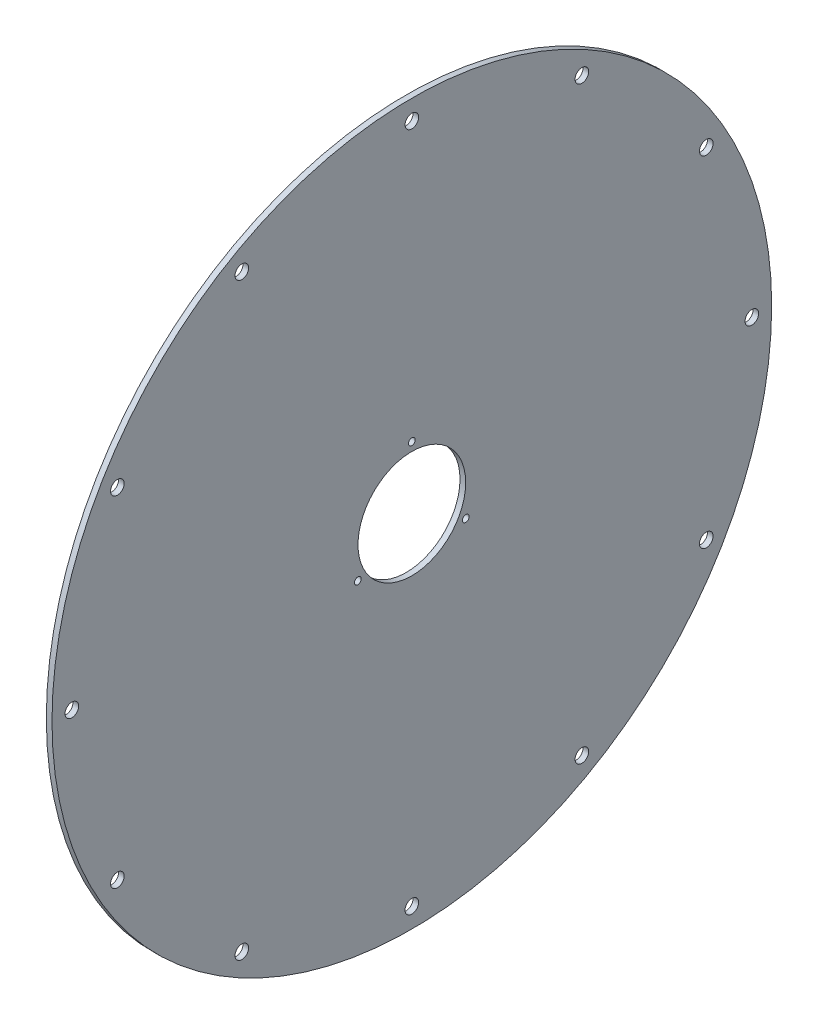
ISO-10303-21;
HEADER;
FILE_DESCRIPTION(('STEP AP214'),'2;1');
FILE_NAME('part.step','',(''),(''),'','','');
FILE_SCHEMA(('AUTOMOTIVE_DESIGN { 1 0 10303 214 1 1 1 1 }'));
ENDSEC;
DATA;
#1=APPLICATION_CONTEXT('core data for automotive mechanical design processes');
#2=APPLICATION_PROTOCOL_DEFINITION('international standard','automotive_design',2000,#1);
#3=PRODUCT_CONTEXT('',#1,'mechanical');
#4=PRODUCT('Part','Part','',(#3));
#5=PRODUCT_RELATED_PRODUCT_CATEGORY('part','',(#4));
#6=PRODUCT_DEFINITION_FORMATION('','',#4);
#7=PRODUCT_DEFINITION_CONTEXT('part definition',#1,'design');
#8=PRODUCT_DEFINITION('design','',#6,#7);
#9=PRODUCT_DEFINITION_SHAPE('','',#8);
#10=(LENGTH_UNIT() NAMED_UNIT(*) SI_UNIT(.MILLI.,.METRE.));
#11=(NAMED_UNIT(*) PLANE_ANGLE_UNIT() SI_UNIT($,.RADIAN.));
#12=(NAMED_UNIT(*) SI_UNIT($,.STERADIAN.) SOLID_ANGLE_UNIT());
#13=UNCERTAINTY_MEASURE_WITH_UNIT(LENGTH_MEASURE(1.E-05),#10,'distance_accuracy_value','');
#14=(GEOMETRIC_REPRESENTATION_CONTEXT(3) GLOBAL_UNCERTAINTY_ASSIGNED_CONTEXT((#13)) GLOBAL_UNIT_ASSIGNED_CONTEXT((#10,
#11,#12)) REPRESENTATION_CONTEXT('',''));
#15=CARTESIAN_POINT('',(0.,0.,0.));
#16=DIRECTION('',(0.,0.,1.));
#17=DIRECTION('',(1.,0.,0.));
#18=AXIS2_PLACEMENT_3D('',#15,#16,#17);
#19=CARTESIAN_POINT('',(5.,0.,0.));
#20=DIRECTION('',(1.,0.,0.));
#21=DIRECTION('',(0.,0.,-1.));
#22=AXIS2_PLACEMENT_3D('',#19,#20,#21);
#23=PLANE('',#22);
#24=CARTESIAN_POINT('',(5.,-27.5000000000002,47.631397208144));
#25=DIRECTION('',(1.,0.,0.));
#26=DIRECTION('',(0.,0.866025403784436,0.500000000000004));
#27=AXIS2_PLACEMENT_3D('',#24,#25,#26);
#28=CIRCLE('',#27,3.);
#29=CARTESIAN_POINT('',(5.,-24.9019237886469,49.131397208144));
#30=VERTEX_POINT('',#29);
#31=EDGE_CURVE('E58',#30,#30,#28,.T.);
#32=ORIENTED_EDGE('',*,*,#31,.F.);
#33=EDGE_LOOP('',(#32));
#34=FACE_BOUND('',#33,.T.);
#35=CARTESIAN_POINT('',(5.,-27.4999999999996,-47.6313972081444));
#36=DIRECTION('',(1.,0.,0.));
#37=DIRECTION('',(0.,-0.866025403784443,0.499999999999992));
#38=AXIS2_PLACEMENT_3D('',#35,#36,#37);
#39=CIRCLE('',#38,3.);
#40=CARTESIAN_POINT('',(5.,-30.0980762113529,-46.1313972081444));
#41=VERTEX_POINT('',#40);
#42=EDGE_CURVE('E63',#41,#41,#39,.T.);
#43=ORIENTED_EDGE('',*,*,#42,.F.);
#44=EDGE_LOOP('',(#43));
#45=FACE_BOUND('',#44,.T.);
#46=CARTESIAN_POINT('',(5.,55.,0.));
#47=DIRECTION('',(1.,0.,0.));
#48=DIRECTION('',(0.,0.,-1.));
#49=AXIS2_PLACEMENT_3D('',#46,#47,#48);
#50=CIRCLE('',#49,3.);
#51=CARTESIAN_POINT('',(5.,55.,-3.));
#52=VERTEX_POINT('',#51);
#53=EDGE_CURVE('E55',#52,#52,#50,.T.);
#54=ORIENTED_EDGE('',*,*,#53,.F.);
#55=EDGE_LOOP('',(#54));
#56=FACE_BOUND('',#55,.T.);
#57=CARTESIAN_POINT('',(5.,-259.807621135332,-149.999999999999));
#58=DIRECTION('',(1.,0.,0.));
#59=DIRECTION('',(0.,-0.86602540378444,-0.499999999999998));
#60=AXIS2_PLACEMENT_3D('',#57,#58,#59);
#61=CIRCLE('',#60,5.99999999999999);
#62=CARTESIAN_POINT('',(5.,-265.003773558039,-152.999999999999));
#63=VERTEX_POINT('',#62);
#64=EDGE_CURVE('E88',#63,#63,#61,.T.);
#65=ORIENTED_EDGE('',*,*,#64,.F.);
#66=EDGE_LOOP('',(#65));
#67=FACE_BOUND('',#66,.T.);
#68=CARTESIAN_POINT('',(5.,-300.,1.04744440165294E-12));
#69=DIRECTION('',(1.,0.,0.));
#70=DIRECTION('',(0.,-1.,0.));
#71=AXIS2_PLACEMENT_3D('',#68,#69,#70);
#72=CIRCLE('',#71,5.99999999999999);
#73=CARTESIAN_POINT('',(5.,-306.,1.068393289686E-12));
#74=VERTEX_POINT('',#73);
#75=EDGE_CURVE('E94',#74,#74,#72,.T.);
#76=ORIENTED_EDGE('',*,*,#75,.F.);
#77=EDGE_LOOP('',(#76));
#78=FACE_BOUND('',#77,.T.);
#79=CARTESIAN_POINT('',(5.,-259.807621135331,150.000000000001));
#80=DIRECTION('',(1.,0.,0.));
#81=DIRECTION('',(0.,-0.866025403784436,0.500000000000004));
#82=AXIS2_PLACEMENT_3D('',#79,#80,#81);
#83=CIRCLE('',#82,5.99999999999999);
#84=CARTESIAN_POINT('',(5.,-265.003773558038,153.000000000001));
#85=VERTEX_POINT('',#84);
#86=EDGE_CURVE('E100',#85,#85,#83,.T.);
#87=ORIENTED_EDGE('',*,*,#86,.F.);
#88=EDGE_LOOP('',(#87));
#89=FACE_BOUND('',#88,.T.);
#90=CARTESIAN_POINT('',(5.,-149.999999999998,259.807621135332));
#91=DIRECTION('',(1.,0.,0.));
#92=DIRECTION('',(0.,-0.499999999999995,0.866025403784442));
#93=AXIS2_PLACEMENT_3D('',#90,#91,#92);
#94=CIRCLE('',#93,5.99999999999999);
#95=CARTESIAN_POINT('',(5.,-152.999999999998,265.003773558039));
#96=VERTEX_POINT('',#95);
#97=EDGE_CURVE('E106',#96,#96,#94,.T.);
#98=ORIENTED_EDGE('',*,*,#97,.F.);
#99=EDGE_LOOP('',(#98));
#100=FACE_BOUND('',#99,.T.);
#101=CARTESIAN_POINT('',(5.,0.,300.));
#102=DIRECTION('',(1.,0.,0.));
#103=DIRECTION('',(0.,0.,1.));
#104=AXIS2_PLACEMENT_3D('',#101,#102,#103);
#105=CIRCLE('',#104,5.99999999999999);
#106=CARTESIAN_POINT('',(5.,0.,306.));
#107=VERTEX_POINT('',#106);
#108=EDGE_CURVE('E112',#107,#107,#105,.T.);
#109=ORIENTED_EDGE('',*,*,#108,.F.);
#110=EDGE_LOOP('',(#109));
#111=FACE_BOUND('',#110,.T.);
#112=CARTESIAN_POINT('',(5.,150.000000000002,259.80762113533));
#113=DIRECTION('',(1.,0.,0.));
#114=DIRECTION('',(0.,0.500000000000007,0.866025403784435));
#115=AXIS2_PLACEMENT_3D('',#112,#113,#114);
#116=CIRCLE('',#115,5.99999999999999);
#117=CARTESIAN_POINT('',(5.,153.000000000002,265.003773558037));
#118=VERTEX_POINT('',#117);
#119=EDGE_CURVE('E118',#118,#118,#116,.T.);
#120=ORIENTED_EDGE('',*,*,#119,.F.);
#121=EDGE_LOOP('',(#120));
#122=FACE_BOUND('',#121,.T.);
#123=CARTESIAN_POINT('',(5.,259.807621135333,149.999999999998));
#124=DIRECTION('',(1.,0.,0.));
#125=DIRECTION('',(0.,0.866025403784443,0.499999999999992));
#126=AXIS2_PLACEMENT_3D('',#123,#124,#125);
#127=CIRCLE('',#126,5.99999999999999);
#128=CARTESIAN_POINT('',(5.,265.00377355804,152.999999999998));
#129=VERTEX_POINT('',#128);
#130=EDGE_CURVE('E124',#129,#129,#127,.T.);
#131=ORIENTED_EDGE('',*,*,#130,.F.);
#132=EDGE_LOOP('',(#131));
#133=FACE_BOUND('',#132,.T.);
#134=CARTESIAN_POINT('',(5.,300.,-3.14233320495882E-12));
#135=DIRECTION('',(1.,0.,0.));
#136=DIRECTION('',(0.,1.,0.));
#137=AXIS2_PLACEMENT_3D('',#134,#135,#136);
#138=CIRCLE('',#137,5.99999999999999);
#139=CARTESIAN_POINT('',(5.,306.,-3.205179869058E-12));
#140=VERTEX_POINT('',#139);
#141=EDGE_CURVE('E75',#140,#140,#138,.T.);
#142=ORIENTED_EDGE('',*,*,#141,.F.);
#143=EDGE_LOOP('',(#142));
#144=FACE_BOUND('',#143,.T.);
#145=CARTESIAN_POINT('',(5.,259.80762113533,-150.000000000003));
#146=DIRECTION('',(1.,0.,0.));
#147=DIRECTION('',(0.,0.866025403784433,-0.50000000000001));
#148=AXIS2_PLACEMENT_3D('',#145,#146,#147);
#149=CIRCLE('',#148,5.99999999999999);
#150=CARTESIAN_POINT('',(5.,265.003773558036,-153.000000000003));
#151=VERTEX_POINT('',#150);
#152=EDGE_CURVE('E76',#151,#151,#149,.T.);
#153=ORIENTED_EDGE('',*,*,#152,.F.);
#154=EDGE_LOOP('',(#153));
#155=FACE_BOUND('',#154,.T.);
#156=CARTESIAN_POINT('',(5.,149.999999999997,-259.807621135334));
#157=DIRECTION('',(1.,0.,0.));
#158=DIRECTION('',(0.,0.499999999999989,-0.866025403784445));
#159=AXIS2_PLACEMENT_3D('',#156,#157,#158);
#160=CIRCLE('',#159,5.99999999999999);
#161=CARTESIAN_POINT('',(5.,152.999999999997,-265.00377355804));
#162=VERTEX_POINT('',#161);
#163=EDGE_CURVE('E54',#162,#162,#160,.T.);
#164=ORIENTED_EDGE('',*,*,#163,.F.);
#165=EDGE_LOOP('',(#164));
#166=FACE_BOUND('',#165,.T.);
#167=CARTESIAN_POINT('',(5.,-150.,-259.807621135331));
#168=DIRECTION('',(1.,0.,0.));
#169=DIRECTION('',(0.,-0.500000000000001,-0.866025403784438));
#170=AXIS2_PLACEMENT_3D('',#167,#168,#169);
#171=CIRCLE('',#170,5.99999999999999);
#172=CARTESIAN_POINT('',(5.,-153.,-265.003773558038));
#173=VERTEX_POINT('',#172);
#174=EDGE_CURVE('E87',#173,#173,#171,.T.);
#175=ORIENTED_EDGE('',*,*,#174,.F.);
#176=EDGE_LOOP('',(#175));
#177=FACE_BOUND('',#176,.T.);
#178=CARTESIAN_POINT('',(5.,0.,-300.));
#179=DIRECTION('',(1.,0.,0.));
#180=DIRECTION('',(0.,0.,-1.));
#181=AXIS2_PLACEMENT_3D('',#178,#179,#180);
#182=CIRCLE('',#181,5.99999999999999);
#183=CARTESIAN_POINT('',(5.,0.,-306.));
#184=VERTEX_POINT('',#183);
#185=EDGE_CURVE('E135',#184,#184,#182,.T.);
#186=ORIENTED_EDGE('',*,*,#185,.F.);
#187=EDGE_LOOP('',(#186));
#188=FACE_BOUND('',#187,.T.);
#189=CARTESIAN_POINT('',(5.,0.,0.));
#190=DIRECTION('',(1.,0.,0.));
#191=DIRECTION('',(0.,0.,-1.));
#192=AXIS2_PLACEMENT_3D('',#189,#190,#191);
#193=CIRCLE('',#192,317.5);
#194=CARTESIAN_POINT('',(5.,0.,-317.5));
#195=VERTEX_POINT('',#194);
#196=EDGE_CURVE('E10',#195,#195,#193,.T.);
#197=ORIENTED_EDGE('',*,*,#196,.T.);
#198=EDGE_LOOP('',(#197));
#199=FACE_BOUND('',#198,.T.);
#200=CARTESIAN_POINT('',(5.,0.,0.));
#201=DIRECTION('',(1.,0.,0.));
#202=DIRECTION('',(0.,0.,-1.));
#203=AXIS2_PLACEMENT_3D('',#200,#201,#202);
#204=CIRCLE('',#203,47.5);
#205=CARTESIAN_POINT('',(5.,0.,-47.5));
#206=VERTEX_POINT('',#205);
#207=EDGE_CURVE('E46',#206,#206,#204,.T.);
#208=ORIENTED_EDGE('',*,*,#207,.F.);
#209=EDGE_LOOP('',(#208));
#210=FACE_BOUND('',#209,.T.);
#211=ADVANCED_FACE('F33',(#34,#45,#56,#67,#78,#89,#100,#111,#122,#133,#144,#155,#166,#177,#188,
#199,#210),#23,.T.);
#212=CARTESIAN_POINT('',(0.,0.,0.));
#213=DIRECTION('',(1.,0.,0.));
#214=DIRECTION('',(0.,0.,-1.));
#215=AXIS2_PLACEMENT_3D('',#212,#213,#214);
#216=PLANE('',#215);
#217=CARTESIAN_POINT('',(0.,-27.5000000000002,47.631397208144));
#218=DIRECTION('',(1.,0.,0.));
#219=DIRECTION('',(0.,0.,-1.));
#220=AXIS2_PLACEMENT_3D('',#217,#218,#219);
#221=CIRCLE('',#220,3.);
#222=CARTESIAN_POINT('',(0.,-27.5000000000002,44.631397208144));
#223=VERTEX_POINT('',#222);
#224=EDGE_CURVE('E37',#223,#223,#221,.T.);
#225=ORIENTED_EDGE('',*,*,#224,.T.);
#226=EDGE_LOOP('',(#225));
#227=FACE_BOUND('',#226,.T.);
#228=CARTESIAN_POINT('',(0.,-27.4999999999996,-47.6313972081444));
#229=DIRECTION('',(1.,0.,0.));
#230=DIRECTION('',(0.,0.,-1.));
#231=AXIS2_PLACEMENT_3D('',#228,#229,#230);
#232=CIRCLE('',#231,3.);
#233=CARTESIAN_POINT('',(0.,-27.4999999999996,-50.6313972081444));
#234=VERTEX_POINT('',#233);
#235=EDGE_CURVE('E56',#234,#234,#232,.T.);
#236=ORIENTED_EDGE('',*,*,#235,.T.);
#237=EDGE_LOOP('',(#236));
#238=FACE_BOUND('',#237,.T.);
#239=CARTESIAN_POINT('',(0.,55.,0.));
#240=DIRECTION('',(1.,0.,0.));
#241=DIRECTION('',(0.,0.,-1.));
#242=AXIS2_PLACEMENT_3D('',#239,#240,#241);
#243=CIRCLE('',#242,3.);
#244=CARTESIAN_POINT('',(0.,55.,-3.));
#245=VERTEX_POINT('',#244);
#246=EDGE_CURVE('E52',#245,#245,#243,.T.);
#247=ORIENTED_EDGE('',*,*,#246,.T.);
#248=EDGE_LOOP('',(#247));
#249=FACE_BOUND('',#248,.T.);
#250=CARTESIAN_POINT('',(0.,-259.807621135332,-149.999999999999));
#251=DIRECTION('',(1.,0.,0.));
#252=DIRECTION('',(0.,-0.86602540378444,-0.499999999999998));
#253=AXIS2_PLACEMENT_3D('',#250,#251,#252);
#254=CIRCLE('',#253,5.99999999999999);
#255=CARTESIAN_POINT('',(0.,-265.003773558039,-152.999999999999));
#256=VERTEX_POINT('',#255);
#257=EDGE_CURVE('E84',#256,#256,#254,.T.);
#258=ORIENTED_EDGE('',*,*,#257,.T.);
#259=EDGE_LOOP('',(#258));
#260=FACE_BOUND('',#259,.T.);
#261=CARTESIAN_POINT('',(0.,-300.,1.04744440165294E-12));
#262=DIRECTION('',(1.,0.,0.));
#263=DIRECTION('',(0.,-1.,0.));
#264=AXIS2_PLACEMENT_3D('',#261,#262,#263);
#265=CIRCLE('',#264,5.99999999999999);
#266=CARTESIAN_POINT('',(0.,-306.,1.068393289686E-12));
#267=VERTEX_POINT('',#266);
#268=EDGE_CURVE('E91',#267,#267,#265,.T.);
#269=ORIENTED_EDGE('',*,*,#268,.T.);
#270=EDGE_LOOP('',(#269));
#271=FACE_BOUND('',#270,.T.);
#272=CARTESIAN_POINT('',(0.,-259.807621135331,150.000000000001));
#273=DIRECTION('',(1.,0.,0.));
#274=DIRECTION('',(0.,-0.866025403784436,0.500000000000004));
#275=AXIS2_PLACEMENT_3D('',#272,#273,#274);
#276=CIRCLE('',#275,5.99999999999999);
#277=CARTESIAN_POINT('',(0.,-265.003773558038,153.000000000001));
#278=VERTEX_POINT('',#277);
#279=EDGE_CURVE('E97',#278,#278,#276,.T.);
#280=ORIENTED_EDGE('',*,*,#279,.T.);
#281=EDGE_LOOP('',(#280));
#282=FACE_BOUND('',#281,.T.);
#283=CARTESIAN_POINT('',(0.,-149.999999999998,259.807621135332));
#284=DIRECTION('',(1.,0.,0.));
#285=DIRECTION('',(0.,-0.499999999999995,0.866025403784442));
#286=AXIS2_PLACEMENT_3D('',#283,#284,#285);
#287=CIRCLE('',#286,5.99999999999999);
#288=CARTESIAN_POINT('',(0.,-152.999999999998,265.003773558039));
#289=VERTEX_POINT('',#288);
#290=EDGE_CURVE('E103',#289,#289,#287,.T.);
#291=ORIENTED_EDGE('',*,*,#290,.T.);
#292=EDGE_LOOP('',(#291));
#293=FACE_BOUND('',#292,.T.);
#294=CARTESIAN_POINT('',(0.,0.,300.));
#295=DIRECTION('',(1.,0.,0.));
#296=DIRECTION('',(0.,0.,1.));
#297=AXIS2_PLACEMENT_3D('',#294,#295,#296);
#298=CIRCLE('',#297,5.99999999999999);
#299=CARTESIAN_POINT('',(0.,0.,306.));
#300=VERTEX_POINT('',#299);
#301=EDGE_CURVE('E109',#300,#300,#298,.T.);
#302=ORIENTED_EDGE('',*,*,#301,.T.);
#303=EDGE_LOOP('',(#302));
#304=FACE_BOUND('',#303,.T.);
#305=CARTESIAN_POINT('',(0.,150.000000000002,259.80762113533));
#306=DIRECTION('',(1.,0.,0.));
#307=DIRECTION('',(0.,0.500000000000007,0.866025403784435));
#308=AXIS2_PLACEMENT_3D('',#305,#306,#307);
#309=CIRCLE('',#308,5.99999999999999);
#310=CARTESIAN_POINT('',(0.,153.000000000002,265.003773558037));
#311=VERTEX_POINT('',#310);
#312=EDGE_CURVE('E115',#311,#311,#309,.T.);
#313=ORIENTED_EDGE('',*,*,#312,.T.);
#314=EDGE_LOOP('',(#313));
#315=FACE_BOUND('',#314,.T.);
#316=CARTESIAN_POINT('',(0.,259.807621135333,149.999999999998));
#317=DIRECTION('',(1.,0.,0.));
#318=DIRECTION('',(0.,0.866025403784443,0.499999999999992));
#319=AXIS2_PLACEMENT_3D('',#316,#317,#318);
#320=CIRCLE('',#319,5.99999999999999);
#321=CARTESIAN_POINT('',(0.,265.00377355804,152.999999999998));
#322=VERTEX_POINT('',#321);
#323=EDGE_CURVE('E121',#322,#322,#320,.T.);
#324=ORIENTED_EDGE('',*,*,#323,.T.);
#325=EDGE_LOOP('',(#324));
#326=FACE_BOUND('',#325,.T.);
#327=CARTESIAN_POINT('',(0.,300.,-3.14233320495882E-12));
#328=DIRECTION('',(1.,0.,0.));
#329=DIRECTION('',(0.,1.,0.));
#330=AXIS2_PLACEMENT_3D('',#327,#328,#329);
#331=CIRCLE('',#330,5.99999999999999);
#332=CARTESIAN_POINT('',(0.,306.,-3.205179869058E-12));
#333=VERTEX_POINT('',#332);
#334=EDGE_CURVE('E127',#333,#333,#331,.T.);
#335=ORIENTED_EDGE('',*,*,#334,.T.);
#336=EDGE_LOOP('',(#335));
#337=FACE_BOUND('',#336,.T.);
#338=CARTESIAN_POINT('',(0.,259.80762113533,-150.000000000003));
#339=DIRECTION('',(1.,0.,0.));
#340=DIRECTION('',(0.,0.866025403784433,-0.50000000000001));
#341=AXIS2_PLACEMENT_3D('',#338,#339,#340);
#342=CIRCLE('',#341,5.99999999999999);
#343=CARTESIAN_POINT('',(0.,265.003773558036,-153.000000000003));
#344=VERTEX_POINT('',#343);
#345=EDGE_CURVE('E72',#344,#344,#342,.T.);
#346=ORIENTED_EDGE('',*,*,#345,.T.);
#347=EDGE_LOOP('',(#346));
#348=FACE_BOUND('',#347,.T.);
#349=CARTESIAN_POINT('',(0.,149.999999999997,-259.807621135334));
#350=DIRECTION('',(1.,0.,0.));
#351=DIRECTION('',(0.,0.499999999999989,-0.866025403784445));
#352=AXIS2_PLACEMENT_3D('',#349,#350,#351);
#353=CIRCLE('',#352,5.99999999999999);
#354=CARTESIAN_POINT('',(0.,152.999999999997,-265.00377355804));
#355=VERTEX_POINT('',#354);
#356=EDGE_CURVE('E79',#355,#355,#353,.T.);
#357=ORIENTED_EDGE('',*,*,#356,.T.);
#358=EDGE_LOOP('',(#357));
#359=FACE_BOUND('',#358,.T.);
#360=CARTESIAN_POINT('',(0.,-150.,-259.807621135331));
#361=DIRECTION('',(1.,0.,0.));
#362=DIRECTION('',(0.,-0.500000000000001,-0.866025403784438));
#363=AXIS2_PLACEMENT_3D('',#360,#361,#362);
#364=CIRCLE('',#363,5.99999999999999);
#365=CARTESIAN_POINT('',(0.,-153.,-265.003773558038));
#366=VERTEX_POINT('',#365);
#367=EDGE_CURVE('E132',#366,#366,#364,.T.);
#368=ORIENTED_EDGE('',*,*,#367,.T.);
#369=EDGE_LOOP('',(#368));
#370=FACE_BOUND('',#369,.T.);
#371=CARTESIAN_POINT('',(0.,0.,-300.));
#372=DIRECTION('',(1.,0.,0.));
#373=DIRECTION('',(0.,0.,-1.));
#374=AXIS2_PLACEMENT_3D('',#371,#372,#373);
#375=CIRCLE('',#374,5.99999999999999);
#376=CARTESIAN_POINT('',(0.,0.,-306.));
#377=VERTEX_POINT('',#376);
#378=EDGE_CURVE('E138',#377,#377,#375,.T.);
#379=ORIENTED_EDGE('',*,*,#378,.T.);
#380=EDGE_LOOP('',(#379));
#381=FACE_BOUND('',#380,.T.);
#382=CARTESIAN_POINT('',(0.,0.,0.));
#383=DIRECTION('',(1.,0.,0.));
#384=DIRECTION('',(0.,0.,-1.));
#385=AXIS2_PLACEMENT_3D('',#382,#383,#384);
#386=CIRCLE('',#385,317.5);
#387=CARTESIAN_POINT('',(0.,0.,-317.5));
#388=VERTEX_POINT('',#387);
#389=EDGE_CURVE('E41',#388,#388,#386,.T.);
#390=ORIENTED_EDGE('',*,*,#389,.F.);
#391=EDGE_LOOP('',(#390));
#392=FACE_BOUND('',#391,.T.);
#393=CARTESIAN_POINT('',(0.,0.,0.));
#394=DIRECTION('',(1.,0.,0.));
#395=DIRECTION('',(0.,0.,-1.));
#396=AXIS2_PLACEMENT_3D('',#393,#394,#395);
#397=CIRCLE('',#396,47.5);
#398=CARTESIAN_POINT('',(0.,0.,-47.5));
#399=VERTEX_POINT('',#398);
#400=EDGE_CURVE('E49',#399,#399,#397,.T.);
#401=ORIENTED_EDGE('',*,*,#400,.T.);
#402=EDGE_LOOP('',(#401));
#403=FACE_BOUND('',#402,.T.);
#404=ADVANCED_FACE('F148',(#227,#238,#249,#260,#271,#282,#293,#304,#315,#326,#337,#348,#359,
#370,#381,#392,#403),#216,.F.);
#405=CARTESIAN_POINT('',(5.,0.,0.));
#406=DIRECTION('',(-1.,0.,0.));
#407=DIRECTION('',(0.,0.,1.));
#408=AXIS2_PLACEMENT_3D('',#405,#406,#407);
#409=CYLINDRICAL_SURFACE('',#408,317.5);
#410=ORIENTED_EDGE('',*,*,#196,.F.);
#411=EDGE_LOOP('',(#410));
#412=FACE_BOUND('',#411,.T.);
#413=ORIENTED_EDGE('',*,*,#389,.T.);
#414=EDGE_LOOP('',(#413));
#415=FACE_BOUND('',#414,.T.);
#416=ADVANCED_FACE('F35',(#412,#415),#409,.T.);
#417=CARTESIAN_POINT('',(5.,0.,0.));
#418=DIRECTION('',(-1.,0.,0.));
#419=DIRECTION('',(0.,0.,1.));
#420=AXIS2_PLACEMENT_3D('',#417,#418,#419);
#421=CYLINDRICAL_SURFACE('',#420,47.5);
#422=ORIENTED_EDGE('',*,*,#207,.T.);
#423=EDGE_LOOP('',(#422));
#424=FACE_BOUND('',#423,.T.);
#425=ORIENTED_EDGE('',*,*,#400,.F.);
#426=EDGE_LOOP('',(#425));
#427=FACE_BOUND('',#426,.T.);
#428=ADVANCED_FACE('F150',(#424,#427),#421,.F.);
#429=CARTESIAN_POINT('',(0.,0.,-300.));
#430=DIRECTION('',(1.,0.,0.));
#431=DIRECTION('',(0.,0.,-1.));
#432=AXIS2_PLACEMENT_3D('',#429,#430,#431);
#433=CYLINDRICAL_SURFACE('',#432,5.99999999999999);
#434=ORIENTED_EDGE('',*,*,#378,.F.);
#435=EDGE_LOOP('',(#434));
#436=FACE_BOUND('',#435,.T.);
#437=ORIENTED_EDGE('',*,*,#185,.T.);
#438=EDGE_LOOP('',(#437));
#439=FACE_BOUND('',#438,.T.);
#440=ADVANCED_FACE('F152',(#436,#439),#433,.F.);
#441=CARTESIAN_POINT('',(0.,-150.,-259.807621135331));
#442=DIRECTION('',(1.,0.,0.));
#443=DIRECTION('',(0.,0.,-1.));
#444=AXIS2_PLACEMENT_3D('',#441,#442,#443);
#445=CYLINDRICAL_SURFACE('',#444,5.99999999999999);
#446=ORIENTED_EDGE('',*,*,#367,.F.);
#447=EDGE_LOOP('',(#446));
#448=FACE_BOUND('',#447,.T.);
#449=ORIENTED_EDGE('',*,*,#174,.T.);
#450=EDGE_LOOP('',(#449));
#451=FACE_BOUND('',#450,.T.);
#452=ADVANCED_FACE('F158',(#448,#451),#445,.F.);
#453=CARTESIAN_POINT('',(0.,149.999999999997,-259.807621135334));
#454=DIRECTION('',(1.,0.,0.));
#455=DIRECTION('',(0.,0.,-1.));
#456=AXIS2_PLACEMENT_3D('',#453,#454,#455);
#457=CYLINDRICAL_SURFACE('',#456,5.99999999999999);
#458=ORIENTED_EDGE('',*,*,#356,.F.);
#459=EDGE_LOOP('',(#458));
#460=FACE_BOUND('',#459,.T.);
#461=ORIENTED_EDGE('',*,*,#163,.T.);
#462=EDGE_LOOP('',(#461));
#463=FACE_BOUND('',#462,.T.);
#464=ADVANCED_FACE('F201',(#460,#463),#457,.F.);
#465=CARTESIAN_POINT('',(0.,259.80762113533,-150.000000000003));
#466=DIRECTION('',(1.,0.,0.));
#467=DIRECTION('',(0.,0.,-1.));
#468=AXIS2_PLACEMENT_3D('',#465,#466,#467);
#469=CYLINDRICAL_SURFACE('',#468,5.99999999999999);
#470=ORIENTED_EDGE('',*,*,#345,.F.);
#471=EDGE_LOOP('',(#470));
#472=FACE_BOUND('',#471,.T.);
#473=ORIENTED_EDGE('',*,*,#152,.T.);
#474=EDGE_LOOP('',(#473));
#475=FACE_BOUND('',#474,.T.);
#476=ADVANCED_FACE('F207',(#472,#475),#469,.F.);
#477=CARTESIAN_POINT('',(0.,300.,-3.14233320495882E-12));
#478=DIRECTION('',(1.,0.,0.));
#479=DIRECTION('',(0.,0.,-1.));
#480=AXIS2_PLACEMENT_3D('',#477,#478,#479);
#481=CYLINDRICAL_SURFACE('',#480,5.99999999999999);
#482=ORIENTED_EDGE('',*,*,#334,.F.);
#483=EDGE_LOOP('',(#482));
#484=FACE_BOUND('',#483,.T.);
#485=ORIENTED_EDGE('',*,*,#141,.T.);
#486=EDGE_LOOP('',(#485));
#487=FACE_BOUND('',#486,.T.);
#488=ADVANCED_FACE('F212',(#484,#487),#481,.F.);
#489=CARTESIAN_POINT('',(0.,259.807621135333,149.999999999998));
#490=DIRECTION('',(1.,0.,0.));
#491=DIRECTION('',(0.,0.,-1.));
#492=AXIS2_PLACEMENT_3D('',#489,#490,#491);
#493=CYLINDRICAL_SURFACE('',#492,5.99999999999999);
#494=ORIENTED_EDGE('',*,*,#323,.F.);
#495=EDGE_LOOP('',(#494));
#496=FACE_BOUND('',#495,.T.);
#497=ORIENTED_EDGE('',*,*,#130,.T.);
#498=EDGE_LOOP('',(#497));
#499=FACE_BOUND('',#498,.T.);
#500=ADVANCED_FACE('F215',(#496,#499),#493,.F.);
#501=CARTESIAN_POINT('',(0.,150.000000000002,259.80762113533));
#502=DIRECTION('',(1.,0.,0.));
#503=DIRECTION('',(0.,0.,-1.));
#504=AXIS2_PLACEMENT_3D('',#501,#502,#503);
#505=CYLINDRICAL_SURFACE('',#504,5.99999999999999);
#506=ORIENTED_EDGE('',*,*,#312,.F.);
#507=EDGE_LOOP('',(#506));
#508=FACE_BOUND('',#507,.T.);
#509=ORIENTED_EDGE('',*,*,#119,.T.);
#510=EDGE_LOOP('',(#509));
#511=FACE_BOUND('',#510,.T.);
#512=ADVANCED_FACE('F219',(#508,#511),#505,.F.);
#513=CARTESIAN_POINT('',(0.,0.,300.));
#514=DIRECTION('',(1.,0.,0.));
#515=DIRECTION('',(0.,0.,-1.));
#516=AXIS2_PLACEMENT_3D('',#513,#514,#515);
#517=CYLINDRICAL_SURFACE('',#516,5.99999999999999);
#518=ORIENTED_EDGE('',*,*,#301,.F.);
#519=EDGE_LOOP('',(#518));
#520=FACE_BOUND('',#519,.T.);
#521=ORIENTED_EDGE('',*,*,#108,.T.);
#522=EDGE_LOOP('',(#521));
#523=FACE_BOUND('',#522,.T.);
#524=ADVANCED_FACE('F223',(#520,#523),#517,.F.);
#525=CARTESIAN_POINT('',(0.,-149.999999999998,259.807621135332));
#526=DIRECTION('',(1.,0.,0.));
#527=DIRECTION('',(0.,0.,-1.));
#528=AXIS2_PLACEMENT_3D('',#525,#526,#527);
#529=CYLINDRICAL_SURFACE('',#528,5.99999999999999);
#530=ORIENTED_EDGE('',*,*,#290,.F.);
#531=EDGE_LOOP('',(#530));
#532=FACE_BOUND('',#531,.T.);
#533=ORIENTED_EDGE('',*,*,#97,.T.);
#534=EDGE_LOOP('',(#533));
#535=FACE_BOUND('',#534,.T.);
#536=ADVANCED_FACE('F227',(#532,#535),#529,.F.);
#537=CARTESIAN_POINT('',(0.,-259.807621135331,150.000000000001));
#538=DIRECTION('',(1.,0.,0.));
#539=DIRECTION('',(0.,0.,-1.));
#540=AXIS2_PLACEMENT_3D('',#537,#538,#539);
#541=CYLINDRICAL_SURFACE('',#540,5.99999999999999);
#542=ORIENTED_EDGE('',*,*,#279,.F.);
#543=EDGE_LOOP('',(#542));
#544=FACE_BOUND('',#543,.T.);
#545=ORIENTED_EDGE('',*,*,#86,.T.);
#546=EDGE_LOOP('',(#545));
#547=FACE_BOUND('',#546,.T.);
#548=ADVANCED_FACE('F231',(#544,#547),#541,.F.);
#549=CARTESIAN_POINT('',(0.,-300.,1.04744440165294E-12));
#550=DIRECTION('',(1.,0.,0.));
#551=DIRECTION('',(0.,0.,-1.));
#552=AXIS2_PLACEMENT_3D('',#549,#550,#551);
#553=CYLINDRICAL_SURFACE('',#552,5.99999999999999);
#554=ORIENTED_EDGE('',*,*,#268,.F.);
#555=EDGE_LOOP('',(#554));
#556=FACE_BOUND('',#555,.T.);
#557=ORIENTED_EDGE('',*,*,#75,.T.);
#558=EDGE_LOOP('',(#557));
#559=FACE_BOUND('',#558,.T.);
#560=ADVANCED_FACE('F235',(#556,#559),#553,.F.);
#561=CARTESIAN_POINT('',(0.,-259.807621135332,-149.999999999999));
#562=DIRECTION('',(1.,0.,0.));
#563=DIRECTION('',(0.,0.,-1.));
#564=AXIS2_PLACEMENT_3D('',#561,#562,#563);
#565=CYLINDRICAL_SURFACE('',#564,5.99999999999999);
#566=ORIENTED_EDGE('',*,*,#257,.F.);
#567=EDGE_LOOP('',(#566));
#568=FACE_BOUND('',#567,.T.);
#569=ORIENTED_EDGE('',*,*,#64,.T.);
#570=EDGE_LOOP('',(#569));
#571=FACE_BOUND('',#570,.T.);
#572=ADVANCED_FACE('F239',(#568,#571),#565,.F.);
#573=CARTESIAN_POINT('',(-5.,55.,0.));
#574=DIRECTION('',(1.,0.,0.));
#575=DIRECTION('',(0.,0.,-1.));
#576=AXIS2_PLACEMENT_3D('',#573,#574,#575);
#577=CYLINDRICAL_SURFACE('',#576,3.);
#578=ORIENTED_EDGE('',*,*,#53,.T.);
#579=EDGE_LOOP('',(#578));
#580=FACE_BOUND('',#579,.T.);
#581=ORIENTED_EDGE('',*,*,#246,.F.);
#582=EDGE_LOOP('',(#581));
#583=FACE_BOUND('',#582,.T.);
#584=ADVANCED_FACE('F242',(#580,#583),#577,.F.);
#585=CARTESIAN_POINT('',(-5.,-27.4999999999996,-47.6313972081444));
#586=DIRECTION('',(1.,0.,0.));
#587=DIRECTION('',(0.,0.,-1.));
#588=AXIS2_PLACEMENT_3D('',#585,#586,#587);
#589=CYLINDRICAL_SURFACE('',#588,3.);
#590=ORIENTED_EDGE('',*,*,#42,.T.);
#591=EDGE_LOOP('',(#590));
#592=FACE_BOUND('',#591,.T.);
#593=ORIENTED_EDGE('',*,*,#235,.F.);
#594=EDGE_LOOP('',(#593));
#595=FACE_BOUND('',#594,.T.);
#596=ADVANCED_FACE('F250',(#592,#595),#589,.F.);
#597=CARTESIAN_POINT('',(-5.,-27.5000000000002,47.631397208144));
#598=DIRECTION('',(1.,0.,0.));
#599=DIRECTION('',(0.,0.,-1.));
#600=AXIS2_PLACEMENT_3D('',#597,#598,#599);
#601=CYLINDRICAL_SURFACE('',#600,3.);
#602=ORIENTED_EDGE('',*,*,#31,.T.);
#603=EDGE_LOOP('',(#602));
#604=FACE_BOUND('',#603,.T.);
#605=ORIENTED_EDGE('',*,*,#224,.F.);
#606=EDGE_LOOP('',(#605));
#607=FACE_BOUND('',#606,.T.);
#608=ADVANCED_FACE('F254',(#604,#607),#601,.F.);
#609=CLOSED_SHELL('',(#211,#404,#416,#428,#440,#452,#464,#476,#488,#500,#512,#524,#536,#548,
#560,#572,#584,#596,#608));
#610=MANIFOLD_SOLID_BREP('B2',#609);
#611=ADVANCED_BREP_SHAPE_REPRESENTATION('',(#18,#610),#14);
#612=SHAPE_DEFINITION_REPRESENTATION(#9,#611);
ENDSEC;
END-ISO-10303-21;
